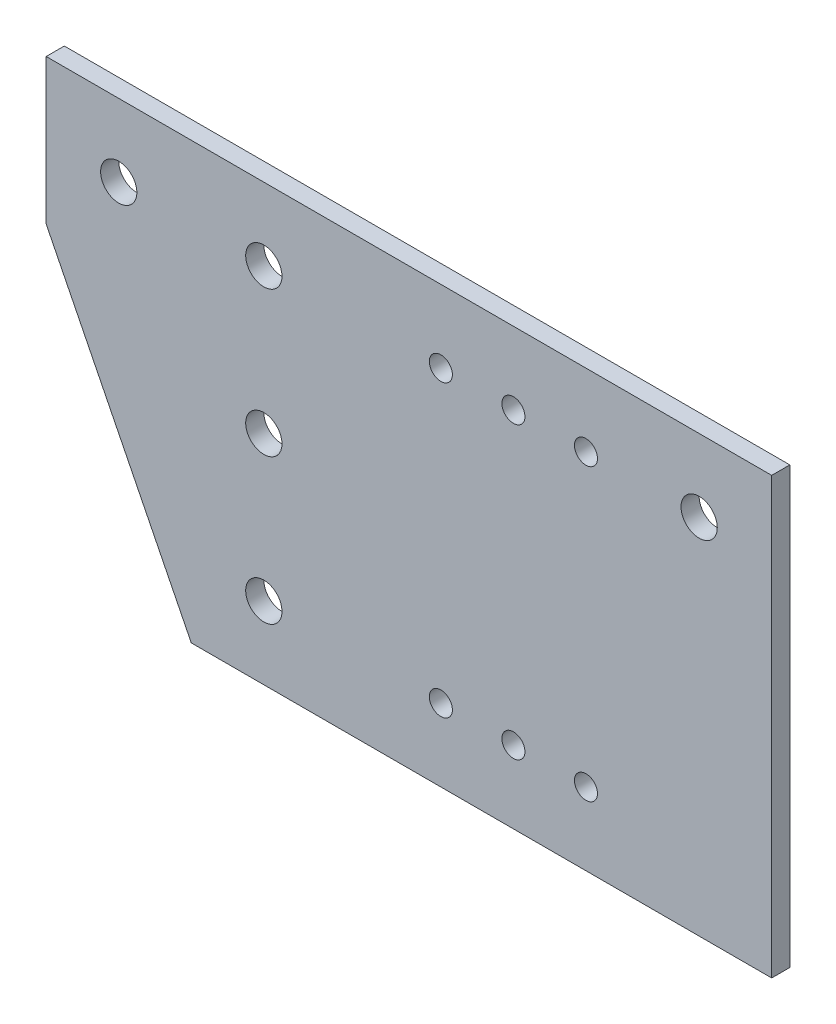
ISO-10303-21;
HEADER;
FILE_DESCRIPTION(('STEP AP214'),'2;1');
FILE_NAME('part.step','',(''),(''),'','','');
FILE_SCHEMA(('AUTOMOTIVE_DESIGN { 1 0 10303 214 1 1 1 1 }'));
ENDSEC;
DATA;
#1=APPLICATION_CONTEXT('core data for automotive mechanical design processes');
#2=APPLICATION_PROTOCOL_DEFINITION('international standard','automotive_design',2000,#1);
#3=PRODUCT_CONTEXT('',#1,'mechanical');
#4=PRODUCT('Part','Part','',(#3));
#5=PRODUCT_RELATED_PRODUCT_CATEGORY('part','',(#4));
#6=PRODUCT_DEFINITION_FORMATION('','',#4);
#7=PRODUCT_DEFINITION_CONTEXT('part definition',#1,'design');
#8=PRODUCT_DEFINITION('design','',#6,#7);
#9=PRODUCT_DEFINITION_SHAPE('','',#8);
#10=(LENGTH_UNIT() NAMED_UNIT(*) SI_UNIT(.MILLI.,.METRE.));
#11=(NAMED_UNIT(*) PLANE_ANGLE_UNIT() SI_UNIT($,.RADIAN.));
#12=(NAMED_UNIT(*) SI_UNIT($,.STERADIAN.) SOLID_ANGLE_UNIT());
#13=UNCERTAINTY_MEASURE_WITH_UNIT(LENGTH_MEASURE(1.E-05),#10,'distance_accuracy_value','');
#14=(GEOMETRIC_REPRESENTATION_CONTEXT(3) GLOBAL_UNCERTAINTY_ASSIGNED_CONTEXT((#13)) GLOBAL_UNIT_ASSIGNED_CONTEXT((#10,
#11,#12)) REPRESENTATION_CONTEXT('',''));
#15=CARTESIAN_POINT('',(0.,0.,0.));
#16=DIRECTION('',(0.,0.,1.));
#17=DIRECTION('',(1.,0.,0.));
#18=AXIS2_PLACEMENT_3D('',#15,#16,#17);
#19=CARTESIAN_POINT('',(0.,0.,3.175));
#20=DIRECTION('',(0.,0.,1.));
#21=DIRECTION('',(1.,0.,0.));
#22=AXIS2_PLACEMENT_3D('',#19,#20,#21);
#23=PLANE('',#22);
#24=CARTESIAN_POINT('',(56.388,-50.8,3.175));
#25=DIRECTION('',(0.,0.,1.));
#26=DIRECTION('',(1.,0.,0.));
#27=AXIS2_PLACEMENT_3D('',#24,#25,#26);
#28=CIRCLE('',#27,2.0193);
#29=CARTESIAN_POINT('',(58.4073,-50.8,3.175));
#30=VERTEX_POINT('',#29);
#31=EDGE_CURVE('E464',#30,#30,#28,.T.);
#32=ORIENTED_EDGE('',*,*,#31,.F.);
#33=EDGE_LOOP('',(#32));
#34=FACE_BOUND('',#33,.T.);
#35=CARTESIAN_POINT('',(43.688,-50.8,3.175));
#36=DIRECTION('',(0.,0.,1.));
#37=DIRECTION('',(1.,0.,0.));
#38=AXIS2_PLACEMENT_3D('',#35,#36,#37);
#39=CIRCLE('',#38,2.0193);
#40=CARTESIAN_POINT('',(45.7073,-50.8,3.175));
#41=VERTEX_POINT('',#40);
#42=EDGE_CURVE('E466',#41,#41,#39,.T.);
#43=ORIENTED_EDGE('',*,*,#42,.F.);
#44=EDGE_LOOP('',(#43));
#45=FACE_BOUND('',#44,.T.);
#46=CARTESIAN_POINT('',(30.988,-50.8,3.175));
#47=DIRECTION('',(0.,0.,1.));
#48=DIRECTION('',(1.,0.,0.));
#49=AXIS2_PLACEMENT_3D('',#46,#47,#48);
#50=CIRCLE('',#49,2.0193);
#51=CARTESIAN_POINT('',(33.0073,-50.8,3.175));
#52=VERTEX_POINT('',#51);
#53=EDGE_CURVE('E472',#52,#52,#50,.T.);
#54=ORIENTED_EDGE('',*,*,#53,.F.);
#55=EDGE_LOOP('',(#54));
#56=FACE_BOUND('',#55,.T.);
#57=CARTESIAN_POINT('',(56.388,0.,3.175));
#58=DIRECTION('',(0.,0.,1.));
#59=DIRECTION('',(1.,0.,0.));
#60=AXIS2_PLACEMENT_3D('',#57,#58,#59);
#61=CIRCLE('',#60,2.0193);
#62=CARTESIAN_POINT('',(58.4073,0.,3.175));
#63=VERTEX_POINT('',#62);
#64=EDGE_CURVE('E477',#63,#63,#61,.T.);
#65=ORIENTED_EDGE('',*,*,#64,.F.);
#66=EDGE_LOOP('',(#65));
#67=FACE_BOUND('',#66,.T.);
#68=CARTESIAN_POINT('',(30.988,0.,3.175));
#69=DIRECTION('',(0.,0.,1.));
#70=DIRECTION('',(1.,0.,0.));
#71=AXIS2_PLACEMENT_3D('',#68,#69,#70);
#72=CIRCLE('',#71,2.0193);
#73=CARTESIAN_POINT('',(33.0073,0.,3.175));
#74=VERTEX_POINT('',#73);
#75=EDGE_CURVE('E467',#74,#74,#72,.T.);
#76=ORIENTED_EDGE('',*,*,#75,.F.);
#77=EDGE_LOOP('',(#76));
#78=FACE_BOUND('',#77,.T.);
#79=CARTESIAN_POINT('',(43.688,0.,3.175));
#80=DIRECTION('',(0.,0.,1.));
#81=DIRECTION('',(1.,0.,0.));
#82=AXIS2_PLACEMENT_3D('',#79,#80,#81);
#83=CIRCLE('',#82,2.0193);
#84=CARTESIAN_POINT('',(45.7073,0.,3.175));
#85=VERTEX_POINT('',#84);
#86=EDGE_CURVE('E157',#85,#85,#83,.T.);
#87=ORIENTED_EDGE('',*,*,#86,.F.);
#88=EDGE_LOOP('',(#87));
#89=FACE_BOUND('',#88,.T.);
#90=CARTESIAN_POINT('',(0.,-25.4,3.175));
#91=DIRECTION('',(0.,0.,1.));
#92=DIRECTION('',(1.,0.,0.));
#93=AXIS2_PLACEMENT_3D('',#90,#91,#92);
#94=CIRCLE('',#93,3.175);
#95=CARTESIAN_POINT('',(3.175,-25.4,3.175));
#96=VERTEX_POINT('',#95);
#97=EDGE_CURVE('E190',#96,#96,#94,.T.);
#98=ORIENTED_EDGE('',*,*,#97,.F.);
#99=EDGE_LOOP('',(#98));
#100=FACE_BOUND('',#99,.T.);
#101=CARTESIAN_POINT('',(-25.4,0.,3.175));
#102=DIRECTION('',(0.,0.,1.));
#103=DIRECTION('',(1.,0.,0.));
#104=AXIS2_PLACEMENT_3D('',#101,#102,#103);
#105=CIRCLE('',#104,3.175);
#106=CARTESIAN_POINT('',(-22.225,0.,3.175));
#107=VERTEX_POINT('',#106);
#108=EDGE_CURVE('E206',#107,#107,#105,.T.);
#109=ORIENTED_EDGE('',*,*,#108,.F.);
#110=EDGE_LOOP('',(#109));
#111=FACE_BOUND('',#110,.T.);
#112=DIRECTION('',(0.,-1.,0.));
#113=VECTOR('',#112,1.);
#114=CARTESIAN_POINT('',(-38.1,12.7,3.175));
#115=LINE('',#114,#113);
#116=CARTESIAN_POINT('',(-38.1,12.7,3.175));
#117=VERTEX_POINT('',#116);
#118=CARTESIAN_POINT('',(-38.1,-12.7,3.175));
#119=VERTEX_POINT('',#118);
#120=EDGE_CURVE('E145',#117,#119,#115,.T.);
#121=ORIENTED_EDGE('',*,*,#120,.T.);
#122=DIRECTION('',(0.447213595499958,-0.894427190999916,0.));
#123=VECTOR('',#122,1.);
#124=CARTESIAN_POINT('',(-38.1,-12.7,3.175));
#125=LINE('',#124,#123);
#126=CARTESIAN_POINT('',(-12.7,-63.5,3.175));
#127=VERTEX_POINT('',#126);
#128=EDGE_CURVE('E102',#119,#127,#125,.T.);
#129=ORIENTED_EDGE('',*,*,#128,.T.);
#130=DIRECTION('',(1.,0.,0.));
#131=VECTOR('',#130,1.);
#132=CARTESIAN_POINT('',(-12.7,-63.5,3.175));
#133=LINE('',#132,#131);
#134=CARTESIAN_POINT('',(88.9,-63.5,3.175));
#135=VERTEX_POINT('',#134);
#136=EDGE_CURVE('E106',#127,#135,#133,.T.);
#137=ORIENTED_EDGE('',*,*,#136,.T.);
#138=DIRECTION('',(0.,1.,0.));
#139=VECTOR('',#138,1.);
#140=CARTESIAN_POINT('',(88.9,-12.7,3.175));
#141=LINE('',#140,#139);
#142=CARTESIAN_POINT('',(88.9,12.7,3.175));
#143=VERTEX_POINT('',#142);
#144=EDGE_CURVE('E110',#135,#143,#141,.T.);
#145=ORIENTED_EDGE('',*,*,#144,.T.);
#146=DIRECTION('',(-1.,0.,0.));
#147=VECTOR('',#146,1.);
#148=CARTESIAN_POINT('',(-38.1,12.7,3.175));
#149=LINE('',#148,#147);
#150=EDGE_CURVE('E69',#143,#117,#149,.T.);
#151=ORIENTED_EDGE('',*,*,#150,.T.);
#152=EDGE_LOOP('',(#121,#129,#137,#145,#151));
#153=FACE_BOUND('',#152,.T.);
#154=CARTESIAN_POINT('',(76.2,0.,3.175));
#155=DIRECTION('',(0.,0.,1.));
#156=DIRECTION('',(1.,0.,0.));
#157=AXIS2_PLACEMENT_3D('',#154,#155,#156);
#158=CIRCLE('',#157,3.175);
#159=CARTESIAN_POINT('',(79.375,0.,3.175));
#160=VERTEX_POINT('',#159);
#161=EDGE_CURVE('E135',#160,#160,#158,.T.);
#162=ORIENTED_EDGE('',*,*,#161,.F.);
#163=EDGE_LOOP('',(#162));
#164=FACE_BOUND('',#163,.T.);
#165=CARTESIAN_POINT('',(0.,0.,3.175));
#166=DIRECTION('',(0.,0.,1.));
#167=DIRECTION('',(1.,0.,0.));
#168=AXIS2_PLACEMENT_3D('',#165,#166,#167);
#169=CIRCLE('',#168,3.175);
#170=CARTESIAN_POINT('',(3.175,0.,3.175));
#171=VERTEX_POINT('',#170);
#172=EDGE_CURVE('E198',#171,#171,#169,.T.);
#173=ORIENTED_EDGE('',*,*,#172,.F.);
#174=EDGE_LOOP('',(#173));
#175=FACE_BOUND('',#174,.T.);
#176=CARTESIAN_POINT('',(0.,-50.8,3.175));
#177=DIRECTION('',(0.,0.,1.));
#178=DIRECTION('',(1.,0.,0.));
#179=AXIS2_PLACEMENT_3D('',#176,#177,#178);
#180=CIRCLE('',#179,3.175);
#181=CARTESIAN_POINT('',(3.175,-50.8,3.175));
#182=VERTEX_POINT('',#181);
#183=EDGE_CURVE('E180',#182,#182,#180,.T.);
#184=ORIENTED_EDGE('',*,*,#183,.F.);
#185=EDGE_LOOP('',(#184));
#186=FACE_BOUND('',#185,.T.);
#187=ADVANCED_FACE('F49',(#34,#45,#56,#67,#78,#89,#100,#111,#153,#164,#175,#186),#23,.T.);
#188=CARTESIAN_POINT('',(0.,0.,0.));
#189=DIRECTION('',(0.,0.,1.));
#190=DIRECTION('',(1.,0.,0.));
#191=AXIS2_PLACEMENT_3D('',#188,#189,#190);
#192=PLANE('',#191);
#193=CARTESIAN_POINT('',(56.388,-50.8,0.));
#194=DIRECTION('',(0.,0.,1.));
#195=DIRECTION('',(1.,0.,0.));
#196=AXIS2_PLACEMENT_3D('',#193,#194,#195);
#197=CIRCLE('',#196,2.0193);
#198=CARTESIAN_POINT('',(58.4073,-50.8,0.));
#199=VERTEX_POINT('',#198);
#200=EDGE_CURVE('E53',#199,#199,#197,.T.);
#201=ORIENTED_EDGE('',*,*,#200,.T.);
#202=EDGE_LOOP('',(#201));
#203=FACE_BOUND('',#202,.T.);
#204=CARTESIAN_POINT('',(43.688,-50.8,0.));
#205=DIRECTION('',(0.,0.,1.));
#206=DIRECTION('',(1.,0.,0.));
#207=AXIS2_PLACEMENT_3D('',#204,#205,#206);
#208=CIRCLE('',#207,2.0193);
#209=CARTESIAN_POINT('',(45.7073,-50.8,0.));
#210=VERTEX_POINT('',#209);
#211=EDGE_CURVE('E168',#210,#210,#208,.T.);
#212=ORIENTED_EDGE('',*,*,#211,.T.);
#213=EDGE_LOOP('',(#212));
#214=FACE_BOUND('',#213,.T.);
#215=CARTESIAN_POINT('',(30.988,-50.8,0.));
#216=DIRECTION('',(0.,0.,1.));
#217=DIRECTION('',(1.,0.,0.));
#218=AXIS2_PLACEMENT_3D('',#215,#216,#217);
#219=CIRCLE('',#218,2.0193);
#220=CARTESIAN_POINT('',(33.0073,-50.8,0.));
#221=VERTEX_POINT('',#220);
#222=EDGE_CURVE('E165',#221,#221,#219,.T.);
#223=ORIENTED_EDGE('',*,*,#222,.T.);
#224=EDGE_LOOP('',(#223));
#225=FACE_BOUND('',#224,.T.);
#226=CARTESIAN_POINT('',(56.388,0.,0.));
#227=DIRECTION('',(0.,0.,1.));
#228=DIRECTION('',(1.,0.,0.));
#229=AXIS2_PLACEMENT_3D('',#226,#227,#228);
#230=CIRCLE('',#229,2.0193);
#231=CARTESIAN_POINT('',(58.4073,0.,0.));
#232=VERTEX_POINT('',#231);
#233=EDGE_CURVE('E161',#232,#232,#230,.T.);
#234=ORIENTED_EDGE('',*,*,#233,.T.);
#235=EDGE_LOOP('',(#234));
#236=FACE_BOUND('',#235,.T.);
#237=CARTESIAN_POINT('',(30.988,0.,0.));
#238=DIRECTION('',(0.,0.,1.));
#239=DIRECTION('',(1.,0.,0.));
#240=AXIS2_PLACEMENT_3D('',#237,#238,#239);
#241=CIRCLE('',#240,2.0193);
#242=CARTESIAN_POINT('',(33.0073,0.,0.));
#243=VERTEX_POINT('',#242);
#244=EDGE_CURVE('E156',#243,#243,#241,.T.);
#245=ORIENTED_EDGE('',*,*,#244,.T.);
#246=EDGE_LOOP('',(#245));
#247=FACE_BOUND('',#246,.T.);
#248=CARTESIAN_POINT('',(43.688,0.,0.));
#249=DIRECTION('',(0.,0.,1.));
#250=DIRECTION('',(1.,0.,0.));
#251=AXIS2_PLACEMENT_3D('',#248,#249,#250);
#252=CIRCLE('',#251,2.0193);
#253=CARTESIAN_POINT('',(45.7073,0.,0.));
#254=VERTEX_POINT('',#253);
#255=EDGE_CURVE('E152',#254,#254,#252,.T.);
#256=ORIENTED_EDGE('',*,*,#255,.T.);
#257=EDGE_LOOP('',(#256));
#258=FACE_BOUND('',#257,.T.);
#259=DIRECTION('',(0.,-1.,0.));
#260=VECTOR('',#259,1.);
#261=CARTESIAN_POINT('',(-38.1,12.7,0.));
#262=LINE('',#261,#260);
#263=CARTESIAN_POINT('',(-38.1,12.7,0.));
#264=VERTEX_POINT('',#263);
#265=CARTESIAN_POINT('',(-38.1,-12.7,0.));
#266=VERTEX_POINT('',#265);
#267=EDGE_CURVE('E130',#264,#266,#262,.T.);
#268=ORIENTED_EDGE('',*,*,#267,.F.);
#269=DIRECTION('',(-1.,0.,0.));
#270=VECTOR('',#269,1.);
#271=CARTESIAN_POINT('',(-38.1,12.7,0.));
#272=LINE('',#271,#270);
#273=CARTESIAN_POINT('',(88.9,12.7,0.));
#274=VERTEX_POINT('',#273);
#275=EDGE_CURVE('E94',#274,#264,#272,.T.);
#276=ORIENTED_EDGE('',*,*,#275,.F.);
#277=DIRECTION('',(0.,1.,0.));
#278=VECTOR('',#277,1.);
#279=CARTESIAN_POINT('',(88.9,12.7,0.));
#280=LINE('',#279,#278);
#281=CARTESIAN_POINT('',(88.9,-63.5,0.));
#282=VERTEX_POINT('',#281);
#283=EDGE_CURVE('E88',#282,#274,#280,.T.);
#284=ORIENTED_EDGE('',*,*,#283,.F.);
#285=DIRECTION('',(1.,0.,0.));
#286=VECTOR('',#285,1.);
#287=CARTESIAN_POINT('',(88.9,-63.5,0.));
#288=LINE('',#287,#286);
#289=CARTESIAN_POINT('',(-12.7,-63.5,0.));
#290=VERTEX_POINT('',#289);
#291=EDGE_CURVE('E118',#290,#282,#288,.T.);
#292=ORIENTED_EDGE('',*,*,#291,.F.);
#293=DIRECTION('',(0.447213595499958,-0.894427190999916,0.));
#294=VECTOR('',#293,1.);
#295=CARTESIAN_POINT('',(-38.1,-12.7,0.));
#296=LINE('',#295,#294);
#297=EDGE_CURVE('E134',#266,#290,#296,.T.);
#298=ORIENTED_EDGE('',*,*,#297,.F.);
#299=EDGE_LOOP('',(#268,#276,#284,#292,#298));
#300=FACE_BOUND('',#299,.T.);
#301=CARTESIAN_POINT('',(76.2,0.,0.));
#302=DIRECTION('',(0.,0.,1.));
#303=DIRECTION('',(1.,0.,0.));
#304=AXIS2_PLACEMENT_3D('',#301,#302,#303);
#305=CIRCLE('',#304,3.175);
#306=CARTESIAN_POINT('',(79.375,0.,0.));
#307=VERTEX_POINT('',#306);
#308=EDGE_CURVE('E210',#307,#307,#305,.T.);
#309=ORIENTED_EDGE('',*,*,#308,.T.);
#310=EDGE_LOOP('',(#309));
#311=FACE_BOUND('',#310,.T.);
#312=CARTESIAN_POINT('',(-25.4,0.,0.));
#313=DIRECTION('',(0.,0.,1.));
#314=DIRECTION('',(1.,0.,0.));
#315=AXIS2_PLACEMENT_3D('',#312,#313,#314);
#316=CIRCLE('',#315,3.175);
#317=CARTESIAN_POINT('',(-22.225,0.,0.));
#318=VERTEX_POINT('',#317);
#319=EDGE_CURVE('E202',#318,#318,#316,.T.);
#320=ORIENTED_EDGE('',*,*,#319,.T.);
#321=EDGE_LOOP('',(#320));
#322=FACE_BOUND('',#321,.T.);
#323=CARTESIAN_POINT('',(0.,0.,0.));
#324=DIRECTION('',(0.,0.,1.));
#325=DIRECTION('',(1.,0.,0.));
#326=AXIS2_PLACEMENT_3D('',#323,#324,#325);
#327=CIRCLE('',#326,3.175);
#328=CARTESIAN_POINT('',(3.175,0.,0.));
#329=VERTEX_POINT('',#328);
#330=EDGE_CURVE('E194',#329,#329,#327,.T.);
#331=ORIENTED_EDGE('',*,*,#330,.T.);
#332=EDGE_LOOP('',(#331));
#333=FACE_BOUND('',#332,.T.);
#334=CARTESIAN_POINT('',(0.,-25.4,0.));
#335=DIRECTION('',(0.,0.,1.));
#336=DIRECTION('',(1.,0.,0.));
#337=AXIS2_PLACEMENT_3D('',#334,#335,#336);
#338=CIRCLE('',#337,3.175);
#339=CARTESIAN_POINT('',(3.175,-25.4,0.));
#340=VERTEX_POINT('',#339);
#341=EDGE_CURVE('E186',#340,#340,#338,.T.);
#342=ORIENTED_EDGE('',*,*,#341,.T.);
#343=EDGE_LOOP('',(#342));
#344=FACE_BOUND('',#343,.T.);
#345=CARTESIAN_POINT('',(0.,-50.8,0.));
#346=DIRECTION('',(0.,0.,1.));
#347=DIRECTION('',(1.,0.,0.));
#348=AXIS2_PLACEMENT_3D('',#345,#346,#347);
#349=CIRCLE('',#348,3.175);
#350=CARTESIAN_POINT('',(3.175,-50.8,0.));
#351=VERTEX_POINT('',#350);
#352=EDGE_CURVE('E175',#351,#351,#349,.T.);
#353=ORIENTED_EDGE('',*,*,#352,.T.);
#354=EDGE_LOOP('',(#353));
#355=FACE_BOUND('',#354,.T.);
#356=ADVANCED_FACE('F228',(#203,#214,#225,#236,#247,#258,#300,#311,#322,#333,#344,#355),#192,.F.);
#357=CARTESIAN_POINT('',(-38.1,12.7,3.175));
#358=DIRECTION('',(1.,0.,0.));
#359=DIRECTION('',(0.,0.,-1.));
#360=AXIS2_PLACEMENT_3D('',#357,#358,#359);
#361=PLANE('',#360);
#362=ORIENTED_EDGE('',*,*,#267,.T.);
#363=DIRECTION('',(0.,0.,-1.));
#364=VECTOR('',#363,1.);
#365=CARTESIAN_POINT('',(-38.1,-12.7,3.175));
#366=LINE('',#365,#364);
#367=EDGE_CURVE('E12',#119,#266,#366,.T.);
#368=ORIENTED_EDGE('',*,*,#367,.F.);
#369=ORIENTED_EDGE('',*,*,#120,.F.);
#370=DIRECTION('',(0.,0.,-1.));
#371=VECTOR('',#370,1.);
#372=CARTESIAN_POINT('',(-38.1,12.7,3.175));
#373=LINE('',#372,#371);
#374=EDGE_CURVE('E126',#117,#264,#373,.T.);
#375=ORIENTED_EDGE('',*,*,#374,.T.);
#376=EDGE_LOOP('',(#362,#368,#369,#375));
#377=FACE_BOUND('',#376,.T.);
#378=ADVANCED_FACE('F51',(#377),#361,.F.);
#379=CARTESIAN_POINT('',(-38.1,-12.7,3.175));
#380=DIRECTION('',(0.894427190999916,0.447213595499958,0.));
#381=DIRECTION('',(-0.447213595499958,0.894427190999916,0.));
#382=AXIS2_PLACEMENT_3D('',#379,#380,#381);
#383=PLANE('',#382);
#384=ORIENTED_EDGE('',*,*,#297,.T.);
#385=DIRECTION('',(0.,0.,-1.));
#386=VECTOR('',#385,1.);
#387=CARTESIAN_POINT('',(-12.7,-63.5,3.175));
#388=LINE('',#387,#386);
#389=EDGE_CURVE('E60',#127,#290,#388,.T.);
#390=ORIENTED_EDGE('',*,*,#389,.F.);
#391=ORIENTED_EDGE('',*,*,#128,.F.);
#392=ORIENTED_EDGE('',*,*,#367,.T.);
#393=EDGE_LOOP('',(#384,#390,#391,#392));
#394=FACE_BOUND('',#393,.T.);
#395=ADVANCED_FACE('F226',(#394),#383,.F.);
#396=CARTESIAN_POINT('',(88.9,-63.5,3.175));
#397=DIRECTION('',(0.,1.,0.));
#398=DIRECTION('',(0.,0.,1.));
#399=AXIS2_PLACEMENT_3D('',#396,#397,#398);
#400=PLANE('',#399);
#401=ORIENTED_EDGE('',*,*,#291,.T.);
#402=DIRECTION('',(0.,0.,-1.));
#403=VECTOR('',#402,1.);
#404=CARTESIAN_POINT('',(88.9,-63.5,3.175));
#405=LINE('',#404,#403);
#406=EDGE_CURVE('E116',#135,#282,#405,.T.);
#407=ORIENTED_EDGE('',*,*,#406,.F.);
#408=ORIENTED_EDGE('',*,*,#136,.F.);
#409=ORIENTED_EDGE('',*,*,#389,.T.);
#410=EDGE_LOOP('',(#401,#407,#408,#409));
#411=FACE_BOUND('',#410,.T.);
#412=ADVANCED_FACE('F117',(#411),#400,.F.);
#413=CARTESIAN_POINT('',(88.9,12.7,3.175));
#414=DIRECTION('',(-1.,0.,0.));
#415=DIRECTION('',(0.,-1.,0.));
#416=AXIS2_PLACEMENT_3D('',#413,#414,#415);
#417=PLANE('',#416);
#418=ORIENTED_EDGE('',*,*,#283,.T.);
#419=DIRECTION('',(0.,0.,-1.));
#420=VECTOR('',#419,1.);
#421=CARTESIAN_POINT('',(88.9,12.7,3.175));
#422=LINE('',#421,#420);
#423=EDGE_CURVE('E120',#143,#274,#422,.T.);
#424=ORIENTED_EDGE('',*,*,#423,.F.);
#425=ORIENTED_EDGE('',*,*,#144,.F.);
#426=ORIENTED_EDGE('',*,*,#406,.T.);
#427=EDGE_LOOP('',(#418,#424,#425,#426));
#428=FACE_BOUND('',#427,.T.);
#429=ADVANCED_FACE('F122',(#428),#417,.F.);
#430=CARTESIAN_POINT('',(-38.1,12.7,3.175));
#431=DIRECTION('',(0.,-1.,0.));
#432=DIRECTION('',(1.,0.,0.));
#433=AXIS2_PLACEMENT_3D('',#430,#431,#432);
#434=PLANE('',#433);
#435=ORIENTED_EDGE('',*,*,#275,.T.);
#436=ORIENTED_EDGE('',*,*,#374,.F.);
#437=ORIENTED_EDGE('',*,*,#150,.F.);
#438=ORIENTED_EDGE('',*,*,#423,.T.);
#439=EDGE_LOOP('',(#435,#436,#437,#438));
#440=FACE_BOUND('',#439,.T.);
#441=ADVANCED_FACE('F267',(#440),#434,.F.);
#442=CARTESIAN_POINT('',(76.2,0.,3.175));
#443=DIRECTION('',(0.,0.,-1.));
#444=DIRECTION('',(-1.,0.,0.));
#445=AXIS2_PLACEMENT_3D('',#442,#443,#444);
#446=CYLINDRICAL_SURFACE('',#445,3.175);
#447=ORIENTED_EDGE('',*,*,#161,.T.);
#448=EDGE_LOOP('',(#447));
#449=FACE_BOUND('',#448,.T.);
#450=ORIENTED_EDGE('',*,*,#308,.F.);
#451=EDGE_LOOP('',(#450));
#452=FACE_BOUND('',#451,.T.);
#453=ADVANCED_FACE('F264',(#449,#452),#446,.F.);
#454=CARTESIAN_POINT('',(-25.4,0.,3.175));
#455=DIRECTION('',(0.,0.,-1.));
#456=DIRECTION('',(-1.,0.,0.));
#457=AXIS2_PLACEMENT_3D('',#454,#455,#456);
#458=CYLINDRICAL_SURFACE('',#457,3.175);
#459=ORIENTED_EDGE('',*,*,#108,.T.);
#460=EDGE_LOOP('',(#459));
#461=FACE_BOUND('',#460,.T.);
#462=ORIENTED_EDGE('',*,*,#319,.F.);
#463=EDGE_LOOP('',(#462));
#464=FACE_BOUND('',#463,.T.);
#465=ADVANCED_FACE('F253',(#461,#464),#458,.F.);
#466=CARTESIAN_POINT('',(0.,0.,3.175));
#467=DIRECTION('',(0.,0.,-1.));
#468=DIRECTION('',(-1.,0.,0.));
#469=AXIS2_PLACEMENT_3D('',#466,#467,#468);
#470=CYLINDRICAL_SURFACE('',#469,3.175);
#471=ORIENTED_EDGE('',*,*,#172,.T.);
#472=EDGE_LOOP('',(#471));
#473=FACE_BOUND('',#472,.T.);
#474=ORIENTED_EDGE('',*,*,#330,.F.);
#475=EDGE_LOOP('',(#474));
#476=FACE_BOUND('',#475,.T.);
#477=ADVANCED_FACE('F243',(#473,#476),#470,.F.);
#478=CARTESIAN_POINT('',(0.,-25.4,3.175));
#479=DIRECTION('',(0.,0.,-1.));
#480=DIRECTION('',(-1.,0.,0.));
#481=AXIS2_PLACEMENT_3D('',#478,#479,#480);
#482=CYLINDRICAL_SURFACE('',#481,3.175);
#483=ORIENTED_EDGE('',*,*,#97,.T.);
#484=EDGE_LOOP('',(#483));
#485=FACE_BOUND('',#484,.T.);
#486=ORIENTED_EDGE('',*,*,#341,.F.);
#487=EDGE_LOOP('',(#486));
#488=FACE_BOUND('',#487,.T.);
#489=ADVANCED_FACE('F240',(#485,#488),#482,.F.);
#490=CARTESIAN_POINT('',(0.,-50.8,3.175));
#491=DIRECTION('',(0.,0.,-1.));
#492=DIRECTION('',(-1.,0.,0.));
#493=AXIS2_PLACEMENT_3D('',#490,#491,#492);
#494=CYLINDRICAL_SURFACE('',#493,3.175);
#495=ORIENTED_EDGE('',*,*,#183,.T.);
#496=EDGE_LOOP('',(#495));
#497=FACE_BOUND('',#496,.T.);
#498=ORIENTED_EDGE('',*,*,#352,.F.);
#499=EDGE_LOOP('',(#498));
#500=FACE_BOUND('',#499,.T.);
#501=ADVANCED_FACE('F242',(#497,#500),#494,.F.);
#502=CARTESIAN_POINT('',(43.688,0.,-1.905));
#503=DIRECTION('',(0.,0.,1.));
#504=DIRECTION('',(1.,0.,0.));
#505=AXIS2_PLACEMENT_3D('',#502,#503,#504);
#506=CYLINDRICAL_SURFACE('',#505,2.0193);
#507=ORIENTED_EDGE('',*,*,#86,.T.);
#508=EDGE_LOOP('',(#507));
#509=FACE_BOUND('',#508,.T.);
#510=ORIENTED_EDGE('',*,*,#255,.F.);
#511=EDGE_LOOP('',(#510));
#512=FACE_BOUND('',#511,.T.);
#513=ADVANCED_FACE('F250',(#509,#512),#506,.F.);
#514=CARTESIAN_POINT('',(30.988,0.,-1.905));
#515=DIRECTION('',(0.,0.,1.));
#516=DIRECTION('',(1.,0.,0.));
#517=AXIS2_PLACEMENT_3D('',#514,#515,#516);
#518=CYLINDRICAL_SURFACE('',#517,2.0193);
#519=ORIENTED_EDGE('',*,*,#75,.T.);
#520=EDGE_LOOP('',(#519));
#521=FACE_BOUND('',#520,.T.);
#522=ORIENTED_EDGE('',*,*,#244,.F.);
#523=EDGE_LOOP('',(#522));
#524=FACE_BOUND('',#523,.T.);
#525=ADVANCED_FACE('F296',(#521,#524),#518,.F.);
#526=CARTESIAN_POINT('',(56.388,0.,-1.905));
#527=DIRECTION('',(0.,0.,1.));
#528=DIRECTION('',(1.,0.,0.));
#529=AXIS2_PLACEMENT_3D('',#526,#527,#528);
#530=CYLINDRICAL_SURFACE('',#529,2.0193);
#531=ORIENTED_EDGE('',*,*,#64,.T.);
#532=EDGE_LOOP('',(#531));
#533=FACE_BOUND('',#532,.T.);
#534=ORIENTED_EDGE('',*,*,#233,.F.);
#535=EDGE_LOOP('',(#534));
#536=FACE_BOUND('',#535,.T.);
#537=ADVANCED_FACE('F308',(#533,#536),#530,.F.);
#538=CARTESIAN_POINT('',(30.988,-50.8,-1.905));
#539=DIRECTION('',(0.,0.,1.));
#540=DIRECTION('',(1.,0.,0.));
#541=AXIS2_PLACEMENT_3D('',#538,#539,#540);
#542=CYLINDRICAL_SURFACE('',#541,2.0193);
#543=ORIENTED_EDGE('',*,*,#53,.T.);
#544=EDGE_LOOP('',(#543));
#545=FACE_BOUND('',#544,.T.);
#546=ORIENTED_EDGE('',*,*,#222,.F.);
#547=EDGE_LOOP('',(#546));
#548=FACE_BOUND('',#547,.T.);
#549=ADVANCED_FACE('F319',(#545,#548),#542,.F.);
#550=CARTESIAN_POINT('',(43.688,-50.8,-1.905));
#551=DIRECTION('',(0.,0.,1.));
#552=DIRECTION('',(1.,0.,0.));
#553=AXIS2_PLACEMENT_3D('',#550,#551,#552);
#554=CYLINDRICAL_SURFACE('',#553,2.0193);
#555=ORIENTED_EDGE('',*,*,#42,.T.);
#556=EDGE_LOOP('',(#555));
#557=FACE_BOUND('',#556,.T.);
#558=ORIENTED_EDGE('',*,*,#211,.F.);
#559=EDGE_LOOP('',(#558));
#560=FACE_BOUND('',#559,.T.);
#561=ADVANCED_FACE('F331',(#557,#560),#554,.F.);
#562=CARTESIAN_POINT('',(56.388,-50.8,-1.905));
#563=DIRECTION('',(0.,0.,1.));
#564=DIRECTION('',(1.,0.,0.));
#565=AXIS2_PLACEMENT_3D('',#562,#563,#564);
#566=CYLINDRICAL_SURFACE('',#565,2.0193);
#567=ORIENTED_EDGE('',*,*,#31,.T.);
#568=EDGE_LOOP('',(#567));
#569=FACE_BOUND('',#568,.T.);
#570=ORIENTED_EDGE('',*,*,#200,.F.);
#571=EDGE_LOOP('',(#570));
#572=FACE_BOUND('',#571,.T.);
#573=ADVANCED_FACE('F341',(#569,#572),#566,.F.);
#574=CLOSED_SHELL('',(#187,#356,#378,#395,#412,#429,#441,#453,#465,#477,#489,#501,#513,#525,
#537,#549,#561,#573));
#575=MANIFOLD_SOLID_BREP('B2',#574);
#576=ADVANCED_BREP_SHAPE_REPRESENTATION('',(#18,#575),#14);
#577=SHAPE_DEFINITION_REPRESENTATION(#9,#576);
ENDSEC;
END-ISO-10303-21;
